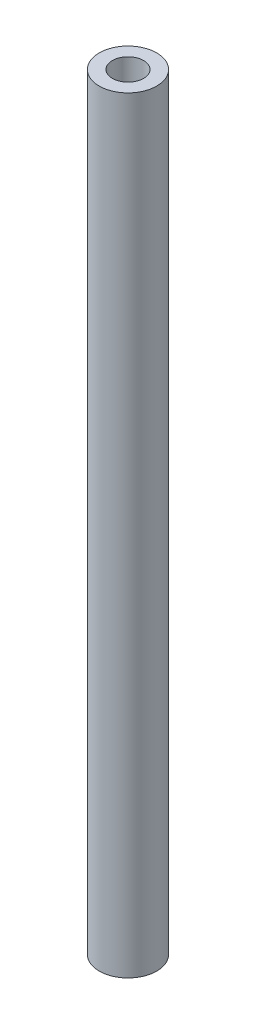
ISO-10303-21;
HEADER;
FILE_DESCRIPTION(('STEP AP214'),'2;1');
FILE_NAME('part.step','',(''),(''),'','','');
FILE_SCHEMA(('AUTOMOTIVE_DESIGN { 1 0 10303 214 1 1 1 1 }'));
ENDSEC;
DATA;
#1=APPLICATION_CONTEXT('core data for automotive mechanical design processes');
#2=APPLICATION_PROTOCOL_DEFINITION('international standard','automotive_design',2000,#1);
#3=PRODUCT_CONTEXT('',#1,'mechanical');
#4=PRODUCT('Part','Part','',(#3));
#5=PRODUCT_RELATED_PRODUCT_CATEGORY('part','',(#4));
#6=PRODUCT_DEFINITION_FORMATION('','',#4);
#7=PRODUCT_DEFINITION_CONTEXT('part definition',#1,'design');
#8=PRODUCT_DEFINITION('design','',#6,#7);
#9=PRODUCT_DEFINITION_SHAPE('','',#8);
#10=(LENGTH_UNIT() NAMED_UNIT(*) SI_UNIT(.MILLI.,.METRE.));
#11=(NAMED_UNIT(*) PLANE_ANGLE_UNIT() SI_UNIT($,.RADIAN.));
#12=(NAMED_UNIT(*) SI_UNIT($,.STERADIAN.) SOLID_ANGLE_UNIT());
#13=UNCERTAINTY_MEASURE_WITH_UNIT(LENGTH_MEASURE(1.E-05),#10,'distance_accuracy_value','');
#14=(GEOMETRIC_REPRESENTATION_CONTEXT(3) GLOBAL_UNCERTAINTY_ASSIGNED_CONTEXT((#13)) GLOBAL_UNIT_ASSIGNED_CONTEXT((#10,
#11,#12)) REPRESENTATION_CONTEXT('',''));
#15=CARTESIAN_POINT('',(0.,0.,0.));
#16=DIRECTION('',(0.,0.,1.));
#17=DIRECTION('',(1.,0.,0.));
#18=AXIS2_PLACEMENT_3D('',#15,#16,#17);
#19=CARTESIAN_POINT('',(0.,203.2,0.));
#20=DIRECTION('',(0.,1.,0.));
#21=DIRECTION('',(0.,0.,1.));
#22=AXIS2_PLACEMENT_3D('',#19,#20,#21);
#23=PLANE('',#22);
#24=CARTESIAN_POINT('',(0.,203.2,0.));
#25=DIRECTION('',(0.,1.,0.));
#26=DIRECTION('',(0.,0.,1.));
#27=AXIS2_PLACEMENT_3D('',#24,#25,#26);
#28=CIRCLE('',#27,7.62);
#29=CARTESIAN_POINT('',(0.,203.2,7.62));
#30=VERTEX_POINT('',#29);
#31=EDGE_CURVE('E10',#30,#30,#28,.T.);
#32=ORIENTED_EDGE('',*,*,#31,.T.);
#33=EDGE_LOOP('',(#32));
#34=FACE_BOUND('',#33,.T.);
#35=CARTESIAN_POINT('',(0.,203.2,0.));
#36=DIRECTION('',(0.,1.,0.));
#37=DIRECTION('',(0.,0.,1.));
#38=AXIS2_PLACEMENT_3D('',#35,#36,#37);
#39=CIRCLE('',#38,4.1275);
#40=CARTESIAN_POINT('',(0.,203.2,4.1275));
#41=VERTEX_POINT('',#40);
#42=EDGE_CURVE('E54',#41,#41,#39,.T.);
#43=ORIENTED_EDGE('',*,*,#42,.F.);
#44=EDGE_LOOP('',(#43));
#45=FACE_BOUND('',#44,.T.);
#46=ADVANCED_FACE('F41',(#34,#45),#23,.T.);
#47=CARTESIAN_POINT('',(0.,0.,0.));
#48=DIRECTION('',(0.,1.,0.));
#49=DIRECTION('',(0.,0.,1.));
#50=AXIS2_PLACEMENT_3D('',#47,#48,#49);
#51=PLANE('',#50);
#52=CARTESIAN_POINT('',(0.,0.,0.));
#53=DIRECTION('',(0.,1.,0.));
#54=DIRECTION('',(0.,0.,1.));
#55=AXIS2_PLACEMENT_3D('',#52,#53,#54);
#56=CIRCLE('',#55,7.62);
#57=CARTESIAN_POINT('',(0.,0.,7.62));
#58=VERTEX_POINT('',#57);
#59=EDGE_CURVE('E45',#58,#58,#56,.T.);
#60=ORIENTED_EDGE('',*,*,#59,.F.);
#61=EDGE_LOOP('',(#60));
#62=FACE_BOUND('',#61,.T.);
#63=CARTESIAN_POINT('',(0.,0.,0.));
#64=DIRECTION('',(0.,1.,0.));
#65=DIRECTION('',(0.,0.,1.));
#66=AXIS2_PLACEMENT_3D('',#63,#64,#65);
#67=CIRCLE('',#66,4.1275);
#68=CARTESIAN_POINT('',(0.,0.,4.1275));
#69=VERTEX_POINT('',#68);
#70=EDGE_CURVE('E56',#69,#69,#67,.T.);
#71=ORIENTED_EDGE('',*,*,#70,.T.);
#72=EDGE_LOOP('',(#71));
#73=FACE_BOUND('',#72,.T.);
#74=ADVANCED_FACE('F68',(#62,#73),#51,.F.);
#75=CARTESIAN_POINT('',(0.,203.2,0.));
#76=DIRECTION('',(0.,-1.,0.));
#77=DIRECTION('',(0.,0.,-1.));
#78=AXIS2_PLACEMENT_3D('',#75,#76,#77);
#79=CYLINDRICAL_SURFACE('',#78,7.62);
#80=ORIENTED_EDGE('',*,*,#31,.F.);
#81=EDGE_LOOP('',(#80));
#82=FACE_BOUND('',#81,.T.);
#83=ORIENTED_EDGE('',*,*,#59,.T.);
#84=EDGE_LOOP('',(#83));
#85=FACE_BOUND('',#84,.T.);
#86=ADVANCED_FACE('F43',(#82,#85),#79,.T.);
#87=CARTESIAN_POINT('',(0.,203.2,0.));
#88=DIRECTION('',(0.,-1.,0.));
#89=DIRECTION('',(0.,0.,-1.));
#90=AXIS2_PLACEMENT_3D('',#87,#88,#89);
#91=CYLINDRICAL_SURFACE('',#90,4.1275);
#92=ORIENTED_EDGE('',*,*,#42,.T.);
#93=EDGE_LOOP('',(#92));
#94=FACE_BOUND('',#93,.T.);
#95=ORIENTED_EDGE('',*,*,#70,.F.);
#96=EDGE_LOOP('',(#95));
#97=FACE_BOUND('',#96,.T.);
#98=ADVANCED_FACE('F64',(#94,#97),#91,.F.);
#99=CLOSED_SHELL('',(#46,#74,#86,#98));
#100=MANIFOLD_SOLID_BREP('B2',#99);
#101=ADVANCED_BREP_SHAPE_REPRESENTATION('',(#18,#100),#14);
#102=SHAPE_DEFINITION_REPRESENTATION(#9,#101);
ENDSEC;
END-ISO-10303-21;
